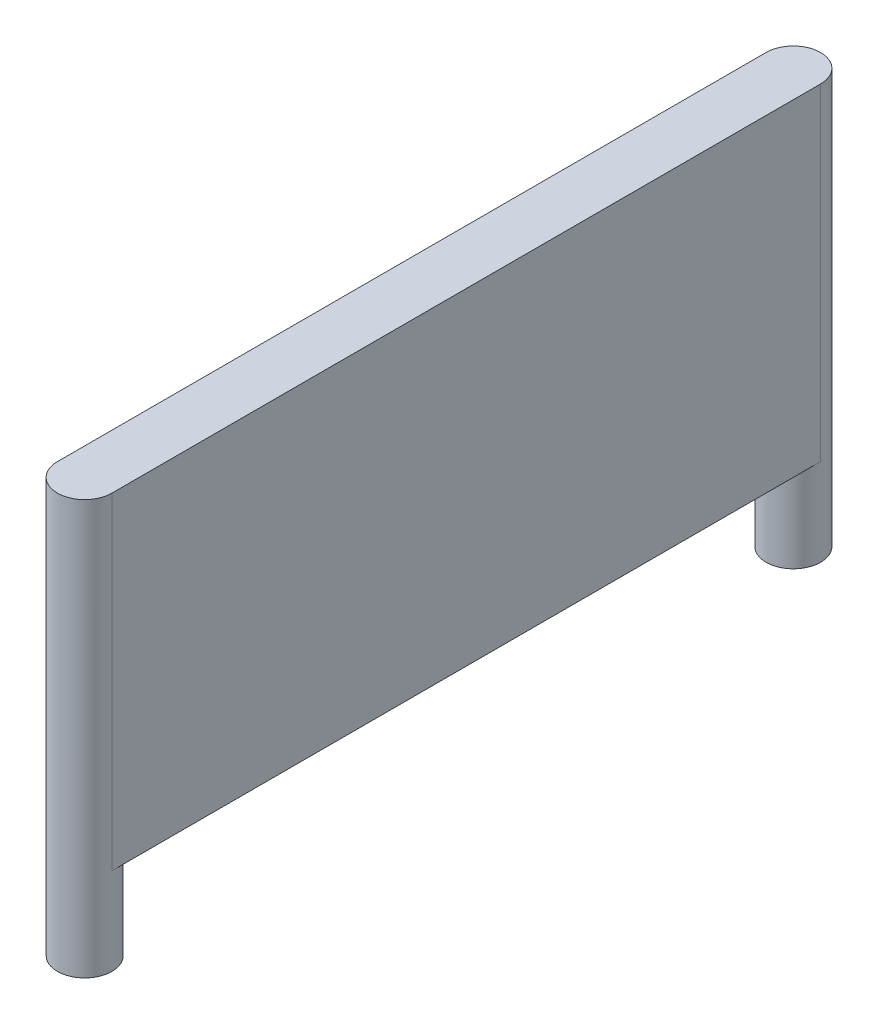
ISO-10303-21;
HEADER;
FILE_DESCRIPTION(('STEP AP214'),'2;1');
FILE_NAME('part.step','',(''),(''),'','','');
FILE_SCHEMA(('AUTOMOTIVE_DESIGN { 1 0 10303 214 1 1 1 1 }'));
ENDSEC;
DATA;
#1=APPLICATION_CONTEXT('core data for automotive mechanical design processes');
#2=APPLICATION_PROTOCOL_DEFINITION('international standard','automotive_design',2000,#1);
#3=PRODUCT_CONTEXT('',#1,'mechanical');
#4=PRODUCT('Part','Part','',(#3));
#5=PRODUCT_RELATED_PRODUCT_CATEGORY('part','',(#4));
#6=PRODUCT_DEFINITION_FORMATION('','',#4);
#7=PRODUCT_DEFINITION_CONTEXT('part definition',#1,'design');
#8=PRODUCT_DEFINITION('design','',#6,#7);
#9=PRODUCT_DEFINITION_SHAPE('','',#8);
#10=(LENGTH_UNIT() NAMED_UNIT(*) SI_UNIT(.MILLI.,.METRE.));
#11=(NAMED_UNIT(*) PLANE_ANGLE_UNIT() SI_UNIT($,.RADIAN.));
#12=(NAMED_UNIT(*) SI_UNIT($,.STERADIAN.) SOLID_ANGLE_UNIT());
#13=UNCERTAINTY_MEASURE_WITH_UNIT(LENGTH_MEASURE(1.E-05),#10,'distance_accuracy_value','');
#14=(GEOMETRIC_REPRESENTATION_CONTEXT(3) GLOBAL_UNCERTAINTY_ASSIGNED_CONTEXT((#13)) GLOBAL_UNIT_ASSIGNED_CONTEXT((#10,
#11,#12)) REPRESENTATION_CONTEXT('',''));
#15=CARTESIAN_POINT('',(0.,0.,0.));
#16=DIRECTION('',(0.,0.,1.));
#17=DIRECTION('',(1.,0.,0.));
#18=AXIS2_PLACEMENT_3D('',#15,#16,#17);
#19=CARTESIAN_POINT('',(0.,0.,0.));
#20=DIRECTION('',(0.,1.,0.));
#21=DIRECTION('',(0.,0.,1.));
#22=AXIS2_PLACEMENT_3D('',#19,#20,#21);
#23=PLANE('',#22);
#24=CARTESIAN_POINT('',(0.,0.,0.));
#25=DIRECTION('',(0.,-1.,0.));
#26=DIRECTION('',(0.,0.,-1.));
#27=AXIS2_PLACEMENT_3D('',#24,#25,#26);
#28=CIRCLE('',#27,3.175);
#29=CARTESIAN_POINT('',(-3.175,0.,0.));
#30=VERTEX_POINT('',#29);
#31=CARTESIAN_POINT('',(3.175,0.,0.));
#32=VERTEX_POINT('',#31);
#33=EDGE_CURVE('E69',#30,#32,#28,.T.);
#34=ORIENTED_EDGE('',*,*,#33,.F.);
#35=DIRECTION('',(0.,0.,1.));
#36=VECTOR('',#35,1.);
#37=CARTESIAN_POINT('',(-3.175,0.,0.));
#38=LINE('',#37,#36);
#39=CARTESIAN_POINT('',(-3.175,0.,-82.55));
#40=VERTEX_POINT('',#39);
#41=EDGE_CURVE('E113',#40,#30,#38,.T.);
#42=ORIENTED_EDGE('',*,*,#41,.F.);
#43=CARTESIAN_POINT('',(0.,0.,-82.55));
#44=DIRECTION('',(0.,-1.,0.));
#45=DIRECTION('',(0.,0.,-1.));
#46=AXIS2_PLACEMENT_3D('',#43,#44,#45);
#47=CIRCLE('',#46,3.175);
#48=CARTESIAN_POINT('',(3.175,0.,-82.55));
#49=VERTEX_POINT('',#48);
#50=EDGE_CURVE('E78',#49,#40,#47,.T.);
#51=ORIENTED_EDGE('',*,*,#50,.F.);
#52=DIRECTION('',(0.,0.,-1.));
#53=VECTOR('',#52,1.);
#54=CARTESIAN_POINT('',(3.175,0.,0.));
#55=LINE('',#54,#53);
#56=EDGE_CURVE('E97',#32,#49,#55,.T.);
#57=ORIENTED_EDGE('',*,*,#56,.F.);
#58=EDGE_LOOP('',(#34,#42,#51,#57));
#59=FACE_BOUND('',#58,.T.);
#60=ADVANCED_FACE('F39',(#59),#23,.F.);
#61=CARTESIAN_POINT('',(0.,38.1,0.));
#62=DIRECTION('',(0.,-1.,0.));
#63=DIRECTION('',(0.,0.,-1.));
#64=AXIS2_PLACEMENT_3D('',#61,#62,#63);
#65=CYLINDRICAL_SURFACE('',#64,3.175);
#66=DIRECTION('',(0.,-1.,0.));
#67=VECTOR('',#66,1.);
#68=CARTESIAN_POINT('',(-3.175,38.1,0.));
#69=LINE('',#68,#67);
#70=CARTESIAN_POINT('',(-3.175,38.1,0.));
#71=VERTEX_POINT('',#70);
#72=EDGE_CURVE('E107',#71,#30,#69,.T.);
#73=ORIENTED_EDGE('',*,*,#72,.T.);
#74=ORIENTED_EDGE('',*,*,#33,.T.);
#75=DIRECTION('',(0.,-1.,0.));
#76=VECTOR('',#75,1.);
#77=CARTESIAN_POINT('',(3.175,38.1,0.));
#78=LINE('',#77,#76);
#79=CARTESIAN_POINT('',(3.175,38.1,0.));
#80=VERTEX_POINT('',#79);
#81=EDGE_CURVE('E11',#80,#32,#78,.T.);
#82=ORIENTED_EDGE('',*,*,#81,.F.);
#83=CARTESIAN_POINT('',(0.,38.1,0.));
#84=DIRECTION('',(0.,1.,0.));
#85=DIRECTION('',(0.,0.,1.));
#86=AXIS2_PLACEMENT_3D('',#83,#84,#85);
#87=CIRCLE('',#86,3.175);
#88=EDGE_CURVE('E91',#71,#80,#87,.T.);
#89=ORIENTED_EDGE('',*,*,#88,.F.);
#90=EDGE_LOOP('',(#73,#74,#82,#89));
#91=FACE_BOUND('',#90,.T.);
#92=CARTESIAN_POINT('',(0.,-10.16,0.));
#93=DIRECTION('',(0.,-1.,0.));
#94=DIRECTION('',(0.,0.,-1.));
#95=AXIS2_PLACEMENT_3D('',#92,#93,#94);
#96=CIRCLE('',#95,3.175);
#97=CARTESIAN_POINT('',(0.,-10.16,-3.175));
#98=VERTEX_POINT('',#97);
#99=EDGE_CURVE('E124',#98,#98,#96,.T.);
#100=ORIENTED_EDGE('',*,*,#99,.F.);
#101=EDGE_LOOP('',(#100));
#102=FACE_BOUND('',#101,.T.);
#103=ADVANCED_FACE('F41',(#91,#102),#65,.T.);
#104=CARTESIAN_POINT('',(3.175,38.1,0.));
#105=DIRECTION('',(-1.,0.,0.));
#106=DIRECTION('',(0.,0.,1.));
#107=AXIS2_PLACEMENT_3D('',#104,#105,#106);
#108=PLANE('',#107);
#109=ORIENTED_EDGE('',*,*,#56,.T.);
#110=DIRECTION('',(0.,-1.,0.));
#111=VECTOR('',#110,1.);
#112=CARTESIAN_POINT('',(3.175,38.1,-82.55));
#113=LINE('',#112,#111);
#114=CARTESIAN_POINT('',(3.175,38.1,-82.55));
#115=VERTEX_POINT('',#114);
#116=EDGE_CURVE('E49',#115,#49,#113,.T.);
#117=ORIENTED_EDGE('',*,*,#116,.F.);
#118=DIRECTION('',(0.,0.,-1.));
#119=VECTOR('',#118,1.);
#120=CARTESIAN_POINT('',(3.175,38.1,0.));
#121=LINE('',#120,#119);
#122=EDGE_CURVE('E84',#80,#115,#121,.T.);
#123=ORIENTED_EDGE('',*,*,#122,.F.);
#124=ORIENTED_EDGE('',*,*,#81,.T.);
#125=EDGE_LOOP('',(#109,#117,#123,#124));
#126=FACE_BOUND('',#125,.T.);
#127=ADVANCED_FACE('F96',(#126),#108,.F.);
#128=CARTESIAN_POINT('',(0.,38.1,-82.55));
#129=DIRECTION('',(0.,-1.,0.));
#130=DIRECTION('',(0.,0.,-1.));
#131=AXIS2_PLACEMENT_3D('',#128,#129,#130);
#132=CYLINDRICAL_SURFACE('',#131,3.175);
#133=ORIENTED_EDGE('',*,*,#116,.T.);
#134=ORIENTED_EDGE('',*,*,#50,.T.);
#135=DIRECTION('',(0.,-1.,0.));
#136=VECTOR('',#135,1.);
#137=CARTESIAN_POINT('',(-3.175,38.1,-82.55));
#138=LINE('',#137,#136);
#139=CARTESIAN_POINT('',(-3.175,38.1,-82.55));
#140=VERTEX_POINT('',#139);
#141=EDGE_CURVE('E100',#140,#40,#138,.T.);
#142=ORIENTED_EDGE('',*,*,#141,.F.);
#143=CARTESIAN_POINT('',(0.,38.1,-82.55));
#144=DIRECTION('',(0.,1.,0.));
#145=DIRECTION('',(0.,0.,1.));
#146=AXIS2_PLACEMENT_3D('',#143,#144,#145);
#147=CIRCLE('',#146,3.175);
#148=EDGE_CURVE('E88',#115,#140,#147,.T.);
#149=ORIENTED_EDGE('',*,*,#148,.F.);
#150=EDGE_LOOP('',(#133,#134,#142,#149));
#151=FACE_BOUND('',#150,.T.);
#152=CARTESIAN_POINT('',(0.,-10.16,-82.55));
#153=DIRECTION('',(0.,-1.,0.));
#154=DIRECTION('',(0.,0.,-1.));
#155=AXIS2_PLACEMENT_3D('',#152,#153,#154);
#156=CIRCLE('',#155,3.175);
#157=CARTESIAN_POINT('',(0.,-10.16,-85.725));
#158=VERTEX_POINT('',#157);
#159=EDGE_CURVE('E114',#158,#158,#156,.T.);
#160=ORIENTED_EDGE('',*,*,#159,.F.);
#161=EDGE_LOOP('',(#160));
#162=FACE_BOUND('',#161,.T.);
#163=ADVANCED_FACE('F101',(#151,#162),#132,.T.);
#164=CARTESIAN_POINT('',(-3.175,38.1,0.));
#165=DIRECTION('',(1.,0.,0.));
#166=DIRECTION('',(0.,0.,-1.));
#167=AXIS2_PLACEMENT_3D('',#164,#165,#166);
#168=PLANE('',#167);
#169=ORIENTED_EDGE('',*,*,#41,.T.);
#170=ORIENTED_EDGE('',*,*,#72,.F.);
#171=DIRECTION('',(0.,0.,1.));
#172=VECTOR('',#171,1.);
#173=CARTESIAN_POINT('',(-3.175,38.1,0.));
#174=LINE('',#173,#172);
#175=EDGE_CURVE('E57',#140,#71,#174,.T.);
#176=ORIENTED_EDGE('',*,*,#175,.F.);
#177=ORIENTED_EDGE('',*,*,#141,.T.);
#178=EDGE_LOOP('',(#169,#170,#176,#177));
#179=FACE_BOUND('',#178,.T.);
#180=ADVANCED_FACE('F122',(#179),#168,.F.);
#181=CARTESIAN_POINT('',(0.,38.1,0.));
#182=DIRECTION('',(0.,1.,0.));
#183=DIRECTION('',(0.,0.,1.));
#184=AXIS2_PLACEMENT_3D('',#181,#182,#183);
#185=PLANE('',#184);
#186=ORIENTED_EDGE('',*,*,#88,.T.);
#187=ORIENTED_EDGE('',*,*,#122,.T.);
#188=ORIENTED_EDGE('',*,*,#148,.T.);
#189=ORIENTED_EDGE('',*,*,#175,.T.);
#190=EDGE_LOOP('',(#186,#187,#188,#189));
#191=FACE_BOUND('',#190,.T.);
#192=ADVANCED_FACE('F86',(#191),#185,.T.);
#193=CARTESIAN_POINT('',(0.,-10.16,-82.55));
#194=DIRECTION('',(0.,-1.,0.));
#195=DIRECTION('',(0.,0.,-1.));
#196=AXIS2_PLACEMENT_3D('',#193,#194,#195);
#197=PLANE('',#196);
#198=ORIENTED_EDGE('',*,*,#159,.T.);
#199=EDGE_LOOP('',(#198));
#200=FACE_BOUND('',#199,.T.);
#201=ADVANCED_FACE('F137',(#200),#197,.T.);
#202=CARTESIAN_POINT('',(0.,-10.16,0.));
#203=DIRECTION('',(0.,-1.,0.));
#204=DIRECTION('',(0.,0.,-1.));
#205=AXIS2_PLACEMENT_3D('',#202,#203,#204);
#206=PLANE('',#205);
#207=ORIENTED_EDGE('',*,*,#99,.T.);
#208=EDGE_LOOP('',(#207));
#209=FACE_BOUND('',#208,.T.);
#210=ADVANCED_FACE('F155',(#209),#206,.T.);
#211=CLOSED_SHELL('',(#60,#103,#127,#163,#180,#192,#201,#210));
#212=MANIFOLD_SOLID_BREP('B2',#211);
#213=ADVANCED_BREP_SHAPE_REPRESENTATION('',(#18,#212),#14);
#214=SHAPE_DEFINITION_REPRESENTATION(#9,#213);
ENDSEC;
END-ISO-10303-21;
